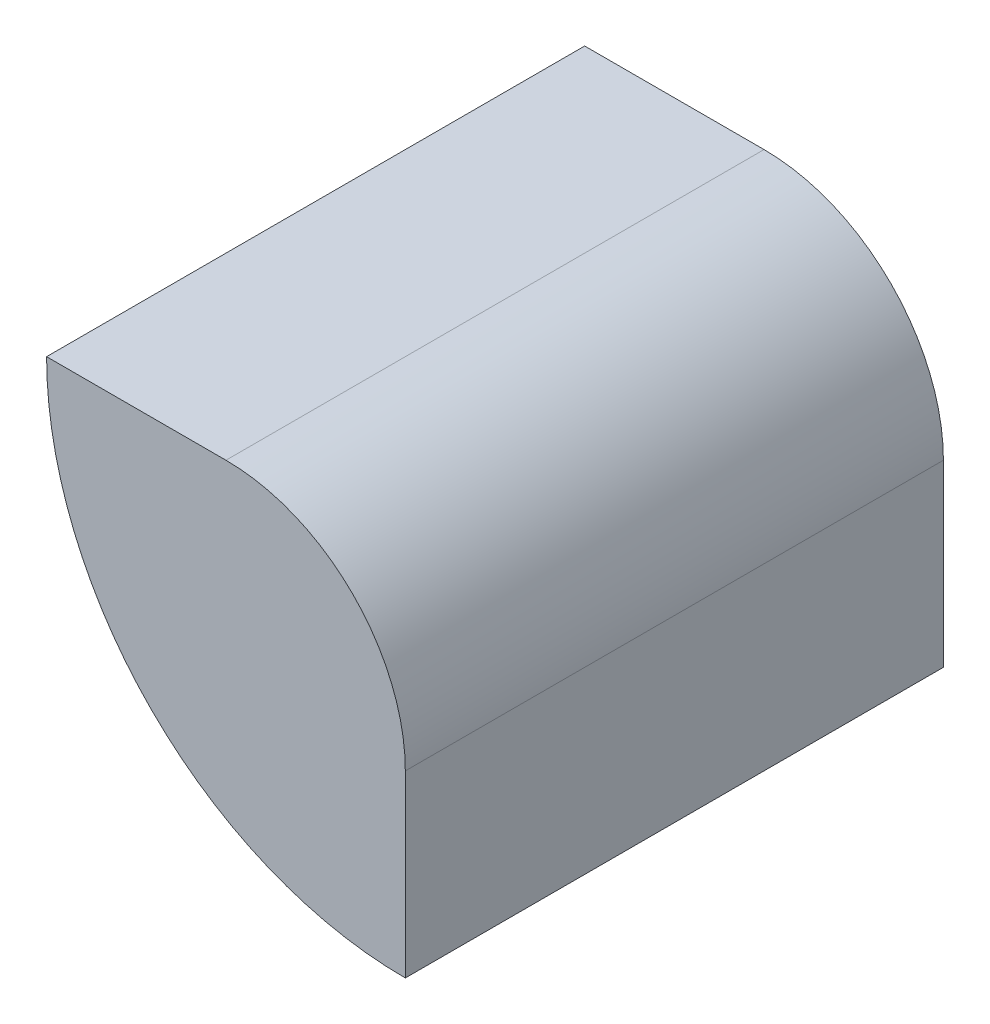
ISO-10303-21;
HEADER;
FILE_DESCRIPTION(('STEP AP214'),'2;1');
FILE_NAME('part.step','',(''),(''),'','','');
FILE_SCHEMA(('AUTOMOTIVE_DESIGN { 1 0 10303 214 1 1 1 1 }'));
ENDSEC;
DATA;
#1=APPLICATION_CONTEXT('core data for automotive mechanical design processes');
#2=APPLICATION_PROTOCOL_DEFINITION('international standard','automotive_design',2000,#1);
#3=PRODUCT_CONTEXT('',#1,'mechanical');
#4=PRODUCT('Part','Part','',(#3));
#5=PRODUCT_RELATED_PRODUCT_CATEGORY('part','',(#4));
#6=PRODUCT_DEFINITION_FORMATION('','',#4);
#7=PRODUCT_DEFINITION_CONTEXT('part definition',#1,'design');
#8=PRODUCT_DEFINITION('design','',#6,#7);
#9=PRODUCT_DEFINITION_SHAPE('','',#8);
#10=(LENGTH_UNIT() NAMED_UNIT(*) SI_UNIT(.MILLI.,.METRE.));
#11=(NAMED_UNIT(*) PLANE_ANGLE_UNIT() SI_UNIT($,.RADIAN.));
#12=(NAMED_UNIT(*) SI_UNIT($,.STERADIAN.) SOLID_ANGLE_UNIT());
#13=UNCERTAINTY_MEASURE_WITH_UNIT(LENGTH_MEASURE(1.E-05),#10,'distance_accuracy_value','');
#14=(GEOMETRIC_REPRESENTATION_CONTEXT(3) GLOBAL_UNCERTAINTY_ASSIGNED_CONTEXT((#13)) GLOBAL_UNIT_ASSIGNED_CONTEXT((#10,
#11,#12)) REPRESENTATION_CONTEXT('',''));
#15=CARTESIAN_POINT('',(0.,0.,0.));
#16=DIRECTION('',(0.,0.,1.));
#17=DIRECTION('',(1.,0.,0.));
#18=AXIS2_PLACEMENT_3D('',#15,#16,#17);
#19=CARTESIAN_POINT('',(-43.3361326434976,-36.9753557589892,15.));
#20=DIRECTION('',(-1.,0.,0.));
#21=DIRECTION('',(0.,-1.,0.));
#22=AXIS2_PLACEMENT_3D('',#19,#20,#21);
#23=PLANE('',#22);
#24=DIRECTION('',(0.,1.,0.));
#25=VECTOR('',#24,1.);
#26=CARTESIAN_POINT('',(-43.3361326434976,-36.9753557589892,0.));
#27=LINE('',#26,#25);
#28=CARTESIAN_POINT('',(-43.3361326434976,-36.9753557589892,0.));
#29=VERTEX_POINT('',#28);
#30=CARTESIAN_POINT('',(-43.3361326434976,-31.9753557589891,0.));
#31=VERTEX_POINT('',#30);
#32=EDGE_CURVE('E95',#29,#31,#27,.T.);
#33=ORIENTED_EDGE('',*,*,#32,.T.);
#34=DIRECTION('',(0.,0.,-1.));
#35=VECTOR('',#34,1.);
#36=CARTESIAN_POINT('',(-43.3361326434976,-31.9753557589891,15.));
#37=LINE('',#36,#35);
#38=CARTESIAN_POINT('',(-43.3361326434976,-31.9753557589891,15.));
#39=VERTEX_POINT('',#38);
#40=EDGE_CURVE('E11',#39,#31,#37,.T.);
#41=ORIENTED_EDGE('',*,*,#40,.F.);
#42=DIRECTION('',(0.,1.,0.));
#43=VECTOR('',#42,1.);
#44=CARTESIAN_POINT('',(-43.3361326434976,-36.9753557589892,15.));
#45=LINE('',#44,#43);
#46=CARTESIAN_POINT('',(-43.3361326434976,-36.9753557589892,15.));
#47=VERTEX_POINT('',#46);
#48=EDGE_CURVE('E80',#47,#39,#45,.T.);
#49=ORIENTED_EDGE('',*,*,#48,.F.);
#50=DIRECTION('',(0.,0.,-1.));
#51=VECTOR('',#50,1.);
#52=CARTESIAN_POINT('',(-43.3361326434976,-36.9753557589892,15.));
#53=LINE('',#52,#51);
#54=EDGE_CURVE('E91',#47,#29,#53,.T.);
#55=ORIENTED_EDGE('',*,*,#54,.T.);
#56=EDGE_LOOP('',(#33,#41,#49,#55));
#57=FACE_BOUND('',#56,.T.);
#58=ADVANCED_FACE('F33',(#57),#23,.F.);
#59=CARTESIAN_POINT('',(-48.3361326434976,-31.9753557589891,15.));
#60=DIRECTION('',(0.,0.,-1.));
#61=DIRECTION('',(-1.,0.,0.));
#62=AXIS2_PLACEMENT_3D('',#59,#60,#61);
#63=CYLINDRICAL_SURFACE('',#62,5.);
#64=CARTESIAN_POINT('',(-48.3361326434976,-31.9753557589891,0.));
#65=DIRECTION('',(0.,0.,1.));
#66=DIRECTION('',(1.,0.,0.));
#67=AXIS2_PLACEMENT_3D('',#64,#65,#66);
#68=CIRCLE('',#67,5.);
#69=CARTESIAN_POINT('',(-48.3361326434976,-26.9753557589891,0.));
#70=VERTEX_POINT('',#69);
#71=EDGE_CURVE('E85',#31,#70,#68,.T.);
#72=ORIENTED_EDGE('',*,*,#71,.T.);
#73=DIRECTION('',(0.,0.,-1.));
#74=VECTOR('',#73,1.);
#75=CARTESIAN_POINT('',(-48.3361326434976,-26.9753557589891,15.));
#76=LINE('',#75,#74);
#77=CARTESIAN_POINT('',(-48.3361326434976,-26.9753557589891,15.));
#78=VERTEX_POINT('',#77);
#79=EDGE_CURVE('E41',#78,#70,#76,.T.);
#80=ORIENTED_EDGE('',*,*,#79,.F.);
#81=CARTESIAN_POINT('',(-48.3361326434976,-31.9753557589891,15.));
#82=DIRECTION('',(0.,0.,1.));
#83=DIRECTION('',(1.,0.,0.));
#84=AXIS2_PLACEMENT_3D('',#81,#82,#83);
#85=CIRCLE('',#84,5.);
#86=EDGE_CURVE('E75',#39,#78,#85,.T.);
#87=ORIENTED_EDGE('',*,*,#86,.F.);
#88=ORIENTED_EDGE('',*,*,#40,.T.);
#89=EDGE_LOOP('',(#72,#80,#87,#88));
#90=FACE_BOUND('',#89,.T.);
#91=ADVANCED_FACE('F84',(#90),#63,.T.);
#92=CARTESIAN_POINT('',(-53.3361326434976,-26.9753557589891,15.));
#93=DIRECTION('',(0.,1.,0.));
#94=DIRECTION('',(-1.,0.,0.));
#95=AXIS2_PLACEMENT_3D('',#92,#93,#94);
#96=PLANE('',#95);
#97=DIRECTION('',(1.,0.,0.));
#98=VECTOR('',#97,1.);
#99=CARTESIAN_POINT('',(-53.3361326434976,-26.9753557589891,0.));
#100=LINE('',#99,#98);
#101=CARTESIAN_POINT('',(-53.3361326434976,-26.9753557589891,0.));
#102=VERTEX_POINT('',#101);
#103=EDGE_CURVE('E99',#102,#70,#100,.T.);
#104=ORIENTED_EDGE('',*,*,#103,.F.);
#105=DIRECTION('',(0.,0.,-1.));
#106=VECTOR('',#105,1.);
#107=CARTESIAN_POINT('',(-53.3361326434976,-26.9753557589891,15.));
#108=LINE('',#107,#106);
#109=CARTESIAN_POINT('',(-53.3361326434976,-26.9753557589891,15.));
#110=VERTEX_POINT('',#109);
#111=EDGE_CURVE('E65',#110,#102,#108,.T.);
#112=ORIENTED_EDGE('',*,*,#111,.F.);
#113=DIRECTION('',(1.,0.,0.));
#114=VECTOR('',#113,1.);
#115=CARTESIAN_POINT('',(-53.3361326434976,-26.9753557589891,15.));
#116=LINE('',#115,#114);
#117=EDGE_CURVE('E78',#110,#78,#116,.T.);
#118=ORIENTED_EDGE('',*,*,#117,.T.);
#119=ORIENTED_EDGE('',*,*,#79,.T.);
#120=EDGE_LOOP('',(#104,#112,#118,#119));
#121=FACE_BOUND('',#120,.T.);
#122=ADVANCED_FACE('F89',(#121),#96,.T.);
#123=CARTESIAN_POINT('',(-43.3361326434976,-26.9753557589891,15.));
#124=DIRECTION('',(0.,0.,-1.));
#125=DIRECTION('',(-1.,0.,0.));
#126=AXIS2_PLACEMENT_3D('',#123,#124,#125);
#127=CYLINDRICAL_SURFACE('',#126,10.);
#128=CARTESIAN_POINT('',(-43.3361326434976,-26.9753557589891,0.));
#129=DIRECTION('',(0.,0.,1.));
#130=DIRECTION('',(1.,0.,0.));
#131=AXIS2_PLACEMENT_3D('',#128,#129,#130);
#132=CIRCLE('',#131,10.);
#133=EDGE_CURVE('E68',#102,#29,#132,.T.);
#134=ORIENTED_EDGE('',*,*,#133,.T.);
#135=ORIENTED_EDGE('',*,*,#54,.F.);
#136=CARTESIAN_POINT('',(-43.3361326434976,-26.9753557589891,15.));
#137=DIRECTION('',(0.,0.,1.));
#138=DIRECTION('',(1.,0.,0.));
#139=AXIS2_PLACEMENT_3D('',#136,#137,#138);
#140=CIRCLE('',#139,10.);
#141=EDGE_CURVE('E49',#110,#47,#140,.T.);
#142=ORIENTED_EDGE('',*,*,#141,.F.);
#143=ORIENTED_EDGE('',*,*,#111,.T.);
#144=EDGE_LOOP('',(#134,#135,#142,#143));
#145=FACE_BOUND('',#144,.T.);
#146=ADVANCED_FACE('F112',(#145),#127,.T.);
#147=CARTESIAN_POINT('',(-48.3361326434976,-31.9753557589891,15.));
#148=DIRECTION('',(0.,0.,1.));
#149=DIRECTION('',(1.,0.,0.));
#150=AXIS2_PLACEMENT_3D('',#147,#148,#149);
#151=PLANE('',#150);
#152=ORIENTED_EDGE('',*,*,#48,.T.);
#153=ORIENTED_EDGE('',*,*,#86,.T.);
#154=ORIENTED_EDGE('',*,*,#117,.F.);
#155=ORIENTED_EDGE('',*,*,#141,.T.);
#156=EDGE_LOOP('',(#152,#153,#154,#155));
#157=FACE_BOUND('',#156,.T.);
#158=ADVANCED_FACE('F76',(#157),#151,.T.);
#159=CARTESIAN_POINT('',(-48.3361326434976,-31.9753557589891,0.));
#160=DIRECTION('',(0.,0.,1.));
#161=DIRECTION('',(1.,0.,0.));
#162=AXIS2_PLACEMENT_3D('',#159,#160,#161);
#163=PLANE('',#162);
#164=ORIENTED_EDGE('',*,*,#32,.F.);
#165=ORIENTED_EDGE('',*,*,#133,.F.);
#166=ORIENTED_EDGE('',*,*,#103,.T.);
#167=ORIENTED_EDGE('',*,*,#71,.F.);
#168=EDGE_LOOP('',(#164,#165,#166,#167));
#169=FACE_BOUND('',#168,.T.);
#170=ADVANCED_FACE('F106',(#169),#163,.F.);
#171=CLOSED_SHELL('',(#58,#91,#122,#146,#158,#170));
#172=MANIFOLD_SOLID_BREP('B2',#171);
#173=ADVANCED_BREP_SHAPE_REPRESENTATION('',(#18,#172),#14);
#174=SHAPE_DEFINITION_REPRESENTATION(#9,#173);
ENDSEC;
END-ISO-10303-21;
